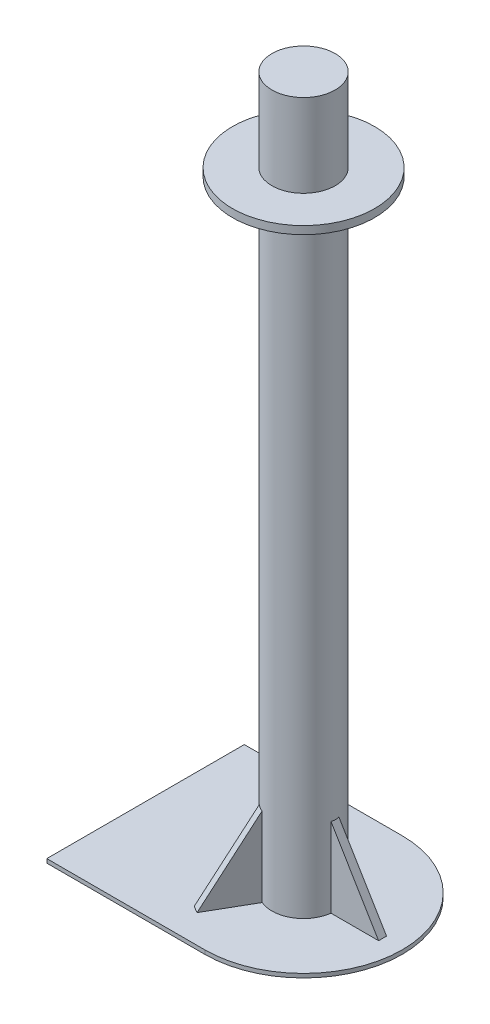
ISO-10303-21;
HEADER;
FILE_DESCRIPTION(('STEP AP214'),'2;1');
FILE_NAME('part.step','',(''),(''),'','','');
FILE_SCHEMA(('AUTOMOTIVE_DESIGN { 1 0 10303 214 1 1 1 1 }'));
ENDSEC;
DATA;
#1=APPLICATION_CONTEXT('core data for automotive mechanical design processes');
#2=APPLICATION_PROTOCOL_DEFINITION('international standard','automotive_design',2000,#1);
#3=PRODUCT_CONTEXT('',#1,'mechanical');
#4=PRODUCT('Part','Part','',(#3));
#5=PRODUCT_RELATED_PRODUCT_CATEGORY('part','',(#4));
#6=PRODUCT_DEFINITION_FORMATION('','',#4);
#7=PRODUCT_DEFINITION_CONTEXT('part definition',#1,'design');
#8=PRODUCT_DEFINITION('design','',#6,#7);
#9=PRODUCT_DEFINITION_SHAPE('','',#8);
#10=(LENGTH_UNIT() NAMED_UNIT(*) SI_UNIT(.MILLI.,.METRE.));
#11=(NAMED_UNIT(*) PLANE_ANGLE_UNIT() SI_UNIT($,.RADIAN.));
#12=(NAMED_UNIT(*) SI_UNIT($,.STERADIAN.) SOLID_ANGLE_UNIT());
#13=UNCERTAINTY_MEASURE_WITH_UNIT(LENGTH_MEASURE(1.E-05),#10,'distance_accuracy_value','');
#14=(GEOMETRIC_REPRESENTATION_CONTEXT(3) GLOBAL_UNCERTAINTY_ASSIGNED_CONTEXT((#13)) GLOBAL_UNIT_ASSIGNED_CONTEXT((#10,
#11,#12)) REPRESENTATION_CONTEXT('',''));
#15=CARTESIAN_POINT('',(0.,0.,0.));
#16=DIRECTION('',(0.,0.,1.));
#17=DIRECTION('',(1.,0.,0.));
#18=AXIS2_PLACEMENT_3D('',#15,#16,#17);
#19=CARTESIAN_POINT('',(-119.914163090129,5.,-125.));
#20=DIRECTION('',(0.,0.,1.));
#21=DIRECTION('',(1.,0.,0.));
#22=AXIS2_PLACEMENT_3D('',#19,#20,#21);
#23=PLANE('',#22);
#24=DIRECTION('',(-1.,0.,0.));
#25=VECTOR('',#24,1.);
#26=CARTESIAN_POINT('',(-119.914163090129,0.,-125.));
#27=LINE('',#26,#25);
#28=CARTESIAN_POINT('',(80.0858369098713,0.,-125.));
#29=VERTEX_POINT('',#28);
#30=CARTESIAN_POINT('',(-119.914163090129,0.,-125.));
#31=VERTEX_POINT('',#30);
#32=EDGE_CURVE('E189',#29,#31,#27,.T.);
#33=ORIENTED_EDGE('',*,*,#32,.T.);
#34=DIRECTION('',(0.,-1.,0.));
#35=VECTOR('',#34,1.);
#36=CARTESIAN_POINT('',(-119.914163090129,5.,-125.));
#37=LINE('',#36,#35);
#38=CARTESIAN_POINT('',(-119.914163090129,5.,-125.));
#39=VERTEX_POINT('',#38);
#40=EDGE_CURVE('E216',#39,#31,#37,.T.);
#41=ORIENTED_EDGE('',*,*,#40,.F.);
#42=DIRECTION('',(-1.,0.,0.));
#43=VECTOR('',#42,1.);
#44=CARTESIAN_POINT('',(-119.914163090129,5.,-125.));
#45=LINE('',#44,#43);
#46=CARTESIAN_POINT('',(80.0858369098713,5.,-125.));
#47=VERTEX_POINT('',#46);
#48=EDGE_CURVE('E190',#47,#39,#45,.T.);
#49=ORIENTED_EDGE('',*,*,#48,.F.);
#50=DIRECTION('',(0.,-1.,0.));
#51=VECTOR('',#50,1.);
#52=CARTESIAN_POINT('',(80.0858369098713,5.,-125.));
#53=LINE('',#52,#51);
#54=EDGE_CURVE('E200',#47,#29,#53,.T.);
#55=ORIENTED_EDGE('',*,*,#54,.T.);
#56=EDGE_LOOP('',(#33,#41,#49,#55));
#57=FACE_BOUND('',#56,.T.);
#58=ADVANCED_FACE('F36',(#57),#23,.F.);
#59=CARTESIAN_POINT('',(-119.914163090129,5.,125.));
#60=DIRECTION('',(1.,0.,0.));
#61=DIRECTION('',(0.,0.,-1.));
#62=AXIS2_PLACEMENT_3D('',#59,#60,#61);
#63=PLANE('',#62);
#64=DIRECTION('',(0.,0.,1.));
#65=VECTOR('',#64,1.);
#66=CARTESIAN_POINT('',(-119.914163090129,0.,125.));
#67=LINE('',#66,#65);
#68=CARTESIAN_POINT('',(-119.914163090129,0.,125.));
#69=VERTEX_POINT('',#68);
#70=EDGE_CURVE('E203',#31,#69,#67,.T.);
#71=ORIENTED_EDGE('',*,*,#70,.T.);
#72=DIRECTION('',(0.,-1.,0.));
#73=VECTOR('',#72,1.);
#74=CARTESIAN_POINT('',(-119.914163090129,5.,125.));
#75=LINE('',#74,#73);
#76=CARTESIAN_POINT('',(-119.914163090129,5.,125.));
#77=VERTEX_POINT('',#76);
#78=EDGE_CURVE('E213',#77,#69,#75,.T.);
#79=ORIENTED_EDGE('',*,*,#78,.F.);
#80=DIRECTION('',(0.,0.,1.));
#81=VECTOR('',#80,1.);
#82=CARTESIAN_POINT('',(-119.914163090129,5.,125.));
#83=LINE('',#82,#81);
#84=EDGE_CURVE('E193',#39,#77,#83,.T.);
#85=ORIENTED_EDGE('',*,*,#84,.F.);
#86=ORIENTED_EDGE('',*,*,#40,.T.);
#87=EDGE_LOOP('',(#71,#79,#85,#86));
#88=FACE_BOUND('',#87,.T.);
#89=ADVANCED_FACE('F268',(#88),#63,.F.);
#90=CARTESIAN_POINT('',(-119.914163090129,5.,125.));
#91=DIRECTION('',(0.,0.,-1.));
#92=DIRECTION('',(-1.,0.,0.));
#93=AXIS2_PLACEMENT_3D('',#90,#91,#92);
#94=PLANE('',#93);
#95=DIRECTION('',(1.,0.,0.));
#96=VECTOR('',#95,1.);
#97=CARTESIAN_POINT('',(-119.914163090129,0.,125.));
#98=LINE('',#97,#96);
#99=CARTESIAN_POINT('',(80.0858369098713,0.,125.));
#100=VERTEX_POINT('',#99);
#101=EDGE_CURVE('E205',#69,#100,#98,.T.);
#102=ORIENTED_EDGE('',*,*,#101,.T.);
#103=DIRECTION('',(0.,-1.,0.));
#104=VECTOR('',#103,1.);
#105=CARTESIAN_POINT('',(80.0858369098713,5.,125.));
#106=LINE('',#105,#104);
#107=CARTESIAN_POINT('',(80.0858369098713,5.,125.));
#108=VERTEX_POINT('',#107);
#109=EDGE_CURVE('E210',#108,#100,#106,.T.);
#110=ORIENTED_EDGE('',*,*,#109,.F.);
#111=DIRECTION('',(1.,0.,0.));
#112=VECTOR('',#111,1.);
#113=CARTESIAN_POINT('',(-119.914163090129,5.,125.));
#114=LINE('',#113,#112);
#115=EDGE_CURVE('E196',#77,#108,#114,.T.);
#116=ORIENTED_EDGE('',*,*,#115,.F.);
#117=ORIENTED_EDGE('',*,*,#78,.T.);
#118=EDGE_LOOP('',(#102,#110,#116,#117));
#119=FACE_BOUND('',#118,.T.);
#120=ADVANCED_FACE('F273',(#119),#94,.F.);
#121=CARTESIAN_POINT('',(80.0858369098713,5.,0.));
#122=DIRECTION('',(0.,-1.,0.));
#123=DIRECTION('',(0.,0.,-1.));
#124=AXIS2_PLACEMENT_3D('',#121,#122,#123);
#125=CYLINDRICAL_SURFACE('',#124,125.);
#126=CARTESIAN_POINT('',(80.0858369098713,0.,0.));
#127=DIRECTION('',(0.,1.,0.));
#128=DIRECTION('',(0.,0.,-1.));
#129=AXIS2_PLACEMENT_3D('',#126,#127,#128);
#130=CIRCLE('',#129,125.);
#131=EDGE_CURVE('E194',#100,#29,#130,.T.);
#132=ORIENTED_EDGE('',*,*,#131,.T.);
#133=ORIENTED_EDGE('',*,*,#54,.F.);
#134=CARTESIAN_POINT('',(80.0858369098713,5.,0.));
#135=DIRECTION('',(0.,1.,0.));
#136=DIRECTION('',(0.,0.,-1.));
#137=AXIS2_PLACEMENT_3D('',#134,#135,#136);
#138=CIRCLE('',#137,125.);
#139=EDGE_CURVE('E198',#108,#47,#138,.T.);
#140=ORIENTED_EDGE('',*,*,#139,.F.);
#141=ORIENTED_EDGE('',*,*,#109,.T.);
#142=EDGE_LOOP('',(#132,#133,#140,#141));
#143=FACE_BOUND('',#142,.T.);
#144=ADVANCED_FACE('F288',(#143),#125,.T.);
#145=CARTESIAN_POINT('',(80.0858369098713,5.,0.));
#146=DIRECTION('',(0.,-1.,0.));
#147=DIRECTION('',(0.,0.,-1.));
#148=AXIS2_PLACEMENT_3D('',#145,#146,#147);
#149=PLANE('',#148);
#150=DIRECTION('',(0.866025403784443,0.,0.499999999999992));
#151=VECTOR('',#150,1.);
#152=CARTESIAN_POINT('',(25.7557098909499,5.,84.1025403784443));
#153=LINE('',#152,#151);
#154=CARTESIAN_POINT('',(25.7557098909499,5.,84.1025403784443));
#155=VERTEX_POINT('',#154);
#156=CARTESIAN_POINT('',(34.4159639287943,5.,89.1025403784443));
#157=VERTEX_POINT('',#156);
#158=EDGE_CURVE('E50',#155,#157,#153,.T.);
#159=ORIENTED_EDGE('',*,*,#158,.F.);
#160=DIRECTION('',(0.499999999999992,0.,-0.866025403784443));
#161=VECTOR('',#160,1.);
#162=CARTESIAN_POINT('',(115.798628345884,4.99999999999998,-71.8563692472863));
#163=LINE('',#162,#161);
#164=CARTESIAN_POINT('',(55.912575057965,5.,31.869317712169));
#165=VERTEX_POINT('',#164);
#166=EDGE_CURVE('E142',#155,#165,#163,.T.);
#167=ORIENTED_EDGE('',*,*,#166,.T.);
#168=CARTESIAN_POINT('',(80.0858369098713,5.,0.));
#169=DIRECTION('',(0.,-1.,0.));
#170=DIRECTION('',(0.,0.,-1.));
#171=AXIS2_PLACEMENT_3D('',#168,#169,#170);
#172=CIRCLE('',#171,40.);
#173=CARTESIAN_POINT('',(55.9125750579645,5.,-31.8693177121687));
#174=VERTEX_POINT('',#173);
#175=EDGE_CURVE('E224',#174,#165,#172,.F.);
#176=ORIENTED_EDGE('',*,*,#175,.F.);
#177=DIRECTION('',(0.500000000000004,0.,0.866025403784436));
#178=VECTOR('',#177,1.);
#179=CARTESIAN_POINT('',(115.798628345885,4.99999999999998,71.8563692472858));
#180=LINE('',#179,#178);
#181=CARTESIAN_POINT('',(25.7557098909487,5.,-84.1025403784436));
#182=VERTEX_POINT('',#181);
#183=EDGE_CURVE('E150',#182,#174,#180,.T.);
#184=ORIENTED_EDGE('',*,*,#183,.F.);
#185=DIRECTION('',(-0.866025403784436,0.,0.500000000000004));
#186=VECTOR('',#185,1.);
#187=CARTESIAN_POINT('',(34.4159639287931,5.,-89.1025403784437));
#188=LINE('',#187,#186);
#189=CARTESIAN_POINT('',(34.4159639287931,5.,-89.1025403784437));
#190=VERTEX_POINT('',#189);
#191=EDGE_CURVE('E157',#190,#182,#188,.T.);
#192=ORIENTED_EDGE('',*,*,#191,.F.);
#193=DIRECTION('',(0.500000000000004,0.,0.866025403784436));
#194=VECTOR('',#193,1.);
#195=CARTESIAN_POINT('',(124.458882383729,4.99999999999998,66.8563692472858));
#196=LINE('',#195,#194);
#197=CARTESIAN_POINT('',(64.5728290958089,5.,-36.8693177121687));
#198=VERTEX_POINT('',#197);
#199=EDGE_CURVE('E151',#190,#198,#196,.T.);
#200=ORIENTED_EDGE('',*,*,#199,.T.);
#201=CARTESIAN_POINT('',(119.77210657584,5.,-5.));
#202=VERTEX_POINT('',#201);
#203=EDGE_CURVE('E220',#202,#198,#172,.F.);
#204=ORIENTED_EDGE('',*,*,#203,.F.);
#205=DIRECTION('',(-1.,0.,0.));
#206=VECTOR('',#205,1.);
#207=CARTESIAN_POINT('',(0.,4.99999999999998,-5.));
#208=LINE('',#207,#206);
#209=CARTESIAN_POINT('',(180.085836909871,5.,-5.));
#210=VERTEX_POINT('',#209);
#211=EDGE_CURVE('E164',#210,#202,#208,.T.);
#212=ORIENTED_EDGE('',*,*,#211,.F.);
#213=DIRECTION('',(0.,0.,-1.));
#214=VECTOR('',#213,1.);
#215=CARTESIAN_POINT('',(180.085836909871,5.,5.));
#216=LINE('',#215,#214);
#217=CARTESIAN_POINT('',(180.085836909871,5.,5.));
#218=VERTEX_POINT('',#217);
#219=EDGE_CURVE('E172',#218,#210,#216,.T.);
#220=ORIENTED_EDGE('',*,*,#219,.F.);
#221=DIRECTION('',(-1.,0.,0.));
#222=VECTOR('',#221,1.);
#223=CARTESIAN_POINT('',(0.,4.99999999999998,5.));
#224=LINE('',#223,#222);
#225=CARTESIAN_POINT('',(119.77210657584,5.,5.));
#226=VERTEX_POINT('',#225);
#227=EDGE_CURVE('E165',#218,#226,#224,.T.);
#228=ORIENTED_EDGE('',*,*,#227,.T.);
#229=CARTESIAN_POINT('',(64.5728290958094,5.,36.8693177121689));
#230=VERTEX_POINT('',#229);
#231=EDGE_CURVE('E219',#230,#226,#172,.F.);
#232=ORIENTED_EDGE('',*,*,#231,.F.);
#233=DIRECTION('',(0.499999999999992,0.,-0.866025403784443));
#234=VECTOR('',#233,1.);
#235=CARTESIAN_POINT('',(124.458882383729,4.99999999999998,-66.8563692472864));
#236=LINE('',#235,#234);
#237=EDGE_CURVE('E55',#157,#230,#236,.T.);
#238=ORIENTED_EDGE('',*,*,#237,.F.);
#239=EDGE_LOOP('',(#159,#167,#176,#184,#192,#200,#204,#212,#220,#228,#232,#238));
#240=FACE_BOUND('',#239,.T.);
#241=ORIENTED_EDGE('',*,*,#48,.T.);
#242=ORIENTED_EDGE('',*,*,#84,.T.);
#243=ORIENTED_EDGE('',*,*,#115,.T.);
#244=ORIENTED_EDGE('',*,*,#139,.T.);
#245=EDGE_LOOP('',(#241,#242,#243,#244));
#246=FACE_BOUND('',#245,.T.);
#247=ADVANCED_FACE('F251',(#240,#246),#149,.F.);
#248=CARTESIAN_POINT('',(80.0858369098713,0.,0.));
#249=DIRECTION('',(0.,-1.,0.));
#250=DIRECTION('',(0.,0.,-1.));
#251=AXIS2_PLACEMENT_3D('',#248,#249,#250);
#252=PLANE('',#251);
#253=ORIENTED_EDGE('',*,*,#32,.F.);
#254=ORIENTED_EDGE('',*,*,#131,.F.);
#255=ORIENTED_EDGE('',*,*,#101,.F.);
#256=ORIENTED_EDGE('',*,*,#70,.F.);
#257=EDGE_LOOP('',(#253,#254,#255,#256));
#258=FACE_BOUND('',#257,.T.);
#259=ADVANCED_FACE('F281',(#258),#252,.T.);
#260=CARTESIAN_POINT('',(80.0858369098713,905.,0.));
#261=DIRECTION('',(0.,-1.,0.));
#262=DIRECTION('',(0.,0.,-1.));
#263=AXIS2_PLACEMENT_3D('',#260,#261,#262);
#264=CYLINDRICAL_SURFACE('',#263,40.);
#265=CARTESIAN_POINT('',(80.0858369098713,790.,0.));
#266=DIRECTION('',(0.,-1.,0.));
#267=DIRECTION('',(0.,0.,-1.));
#268=AXIS2_PLACEMENT_3D('',#265,#266,#267);
#269=CIRCLE('',#268,40.);
#270=CARTESIAN_POINT('',(80.0858369098713,790.,-40.));
#271=VERTEX_POINT('',#270);
#272=EDGE_CURVE('E183',#271,#271,#269,.T.);
#273=ORIENTED_EDGE('',*,*,#272,.T.);
#274=EDGE_LOOP('',(#273));
#275=FACE_BOUND('',#274,.T.);
#276=ORIENTED_EDGE('',*,*,#175,.T.);
#277=DIRECTION('',(0.,-1.,0.));
#278=VECTOR('',#277,1.);
#279=CARTESIAN_POINT('',(55.912575057965,905.,31.869317712169));
#280=LINE('',#279,#278);
#281=CARTESIAN_POINT('',(55.912575057965,105.522883890052,31.869317712169));
#282=VERTEX_POINT('',#281);
#283=EDGE_CURVE('E11',#165,#282,#280,.F.);
#284=ORIENTED_EDGE('',*,*,#283,.T.);
#285=CARTESIAN_POINT('',(80.0858369098713,171.666666666667,0.));
#286=DIRECTION('',(-0.428746462856265,0.514495755427526,0.74261065723251));
#287=DIRECTION('',(-0.257247877713759,-0.857492925712544,0.445566394339506));
#288=AXIS2_PLACEMENT_3D('',#285,#286,#287);
#289=ELLIPSE('',#288,77.746025264604,40.);
#290=CARTESIAN_POINT('',(64.5728290958094,105.522883890052,36.8693177121689));
#291=VERTEX_POINT('',#290);
#292=EDGE_CURVE('E43',#282,#291,#289,.T.);
#293=ORIENTED_EDGE('',*,*,#292,.T.);
#294=DIRECTION('',(0.,-1.,0.));
#295=VECTOR('',#294,1.);
#296=CARTESIAN_POINT('',(64.5728290958094,905.,36.8693177121689));
#297=LINE('',#296,#295);
#298=EDGE_CURVE('E131',#230,#291,#297,.F.);
#299=ORIENTED_EDGE('',*,*,#298,.F.);
#300=ORIENTED_EDGE('',*,*,#231,.T.);
#301=DIRECTION('',(0.,-1.,0.));
#302=VECTOR('',#301,1.);
#303=CARTESIAN_POINT('',(119.77210657584,905.,5.));
#304=LINE('',#303,#302);
#305=CARTESIAN_POINT('',(119.77210657584,105.522883890052,5.));
#306=VERTEX_POINT('',#305);
#307=EDGE_CURVE('E234',#226,#306,#304,.F.);
#308=ORIENTED_EDGE('',*,*,#307,.T.);
#309=CARTESIAN_POINT('',(80.0858369098713,171.666666666667,0.));
#310=DIRECTION('',(0.857492925712544,0.514495755427526,0.));
#311=DIRECTION('',(0.514495755427526,-0.857492925712544,0.));
#312=AXIS2_PLACEMENT_3D('',#309,#310,#311);
#313=ELLIPSE('',#312,77.746025264604,40.);
#314=CARTESIAN_POINT('',(119.77210657584,105.522883890052,-5.));
#315=VERTEX_POINT('',#314);
#316=EDGE_CURVE('E232',#306,#315,#313,.T.);
#317=ORIENTED_EDGE('',*,*,#316,.T.);
#318=DIRECTION('',(0.,-1.,0.));
#319=VECTOR('',#318,1.);
#320=CARTESIAN_POINT('',(119.77210657584,905.,-5.));
#321=LINE('',#320,#319);
#322=EDGE_CURVE('E229',#202,#315,#321,.F.);
#323=ORIENTED_EDGE('',*,*,#322,.F.);
#324=ORIENTED_EDGE('',*,*,#203,.T.);
#325=DIRECTION('',(0.,-1.,0.));
#326=VECTOR('',#325,1.);
#327=CARTESIAN_POINT('',(64.5728290958089,905.,-36.8693177121687));
#328=LINE('',#327,#326);
#329=CARTESIAN_POINT('',(64.5728290958089,105.522883890052,-36.8693177121687));
#330=VERTEX_POINT('',#329);
#331=EDGE_CURVE('E139',#198,#330,#328,.F.);
#332=ORIENTED_EDGE('',*,*,#331,.T.);
#333=CARTESIAN_POINT('',(80.0858369098713,171.666666666667,0.));
#334=DIRECTION('',(-0.428746462856276,0.514495755427527,-0.742610657232504));
#335=DIRECTION('',(-0.257247877713765,-0.857492925712544,-0.445566394339502));
#336=AXIS2_PLACEMENT_3D('',#333,#334,#335);
#337=ELLIPSE('',#336,77.746025264604,40.);
#338=CARTESIAN_POINT('',(55.9125750579645,105.522883890052,-31.8693177121687));
#339=VERTEX_POINT('',#338);
#340=EDGE_CURVE('E239',#330,#339,#337,.T.);
#341=ORIENTED_EDGE('',*,*,#340,.T.);
#342=DIRECTION('',(0.,-1.,0.));
#343=VECTOR('',#342,1.);
#344=CARTESIAN_POINT('',(55.9125750579645,905.,-31.8693177121687));
#345=LINE('',#344,#343);
#346=EDGE_CURVE('E236',#174,#339,#345,.F.);
#347=ORIENTED_EDGE('',*,*,#346,.F.);
#348=EDGE_LOOP('',(#276,#284,#293,#299,#300,#308,#317,#323,#324,#332,#341,#347));
#349=FACE_BOUND('',#348,.T.);
#350=ADVANCED_FACE('F130',(#275,#349),#264,.T.);
#351=CARTESIAN_POINT('',(80.0858369098713,800.,0.));
#352=DIRECTION('',(0.,-1.,0.));
#353=DIRECTION('',(0.,0.,-1.));
#354=AXIS2_PLACEMENT_3D('',#351,#352,#353);
#355=CYLINDRICAL_SURFACE('',#354,90.);
#356=CARTESIAN_POINT('',(80.0858369098713,800.,0.));
#357=DIRECTION('',(0.,-1.,0.));
#358=DIRECTION('',(0.,0.,-1.));
#359=AXIS2_PLACEMENT_3D('',#356,#357,#358);
#360=CIRCLE('',#359,90.);
#361=CARTESIAN_POINT('',(80.0858369098713,800.,-90.));
#362=VERTEX_POINT('',#361);
#363=EDGE_CURVE('E180',#362,#362,#360,.T.);
#364=ORIENTED_EDGE('',*,*,#363,.T.);
#365=EDGE_LOOP('',(#364));
#366=FACE_BOUND('',#365,.T.);
#367=CARTESIAN_POINT('',(80.0858369098713,790.,0.));
#368=DIRECTION('',(0.,-1.,0.));
#369=DIRECTION('',(0.,0.,-1.));
#370=AXIS2_PLACEMENT_3D('',#367,#368,#369);
#371=CIRCLE('',#370,90.);
#372=CARTESIAN_POINT('',(80.0858369098713,790.,-90.));
#373=VERTEX_POINT('',#372);
#374=EDGE_CURVE('E179',#373,#373,#371,.T.);
#375=ORIENTED_EDGE('',*,*,#374,.F.);
#376=EDGE_LOOP('',(#375));
#377=FACE_BOUND('',#376,.T.);
#378=ADVANCED_FACE('F303',(#366,#377),#355,.T.);
#379=CARTESIAN_POINT('',(80.0858369098713,800.,0.));
#380=DIRECTION('',(0.,-1.,0.));
#381=DIRECTION('',(0.,0.,-1.));
#382=AXIS2_PLACEMENT_3D('',#379,#380,#381);
#383=PLANE('',#382);
#384=CARTESIAN_POINT('',(80.0858369098713,800.,0.));
#385=DIRECTION('',(0.,-1.,0.));
#386=DIRECTION('',(0.,0.,-1.));
#387=AXIS2_PLACEMENT_3D('',#384,#385,#386);
#388=CIRCLE('',#387,40.);
#389=CARTESIAN_POINT('',(80.0858369098713,800.,-40.));
#390=VERTEX_POINT('',#389);
#391=EDGE_CURVE('E223',#390,#390,#388,.T.);
#392=ORIENTED_EDGE('',*,*,#391,.T.);
#393=EDGE_LOOP('',(#392));
#394=FACE_BOUND('',#393,.T.);
#395=ORIENTED_EDGE('',*,*,#363,.F.);
#396=EDGE_LOOP('',(#395));
#397=FACE_BOUND('',#396,.T.);
#398=ADVANCED_FACE('F313',(#394,#397),#383,.F.);
#399=CARTESIAN_POINT('',(80.0858369098713,790.,0.));
#400=DIRECTION('',(0.,-1.,0.));
#401=DIRECTION('',(0.,0.,-1.));
#402=AXIS2_PLACEMENT_3D('',#399,#400,#401);
#403=PLANE('',#402);
#404=ORIENTED_EDGE('',*,*,#272,.F.);
#405=EDGE_LOOP('',(#404));
#406=FACE_BOUND('',#405,.T.);
#407=ORIENTED_EDGE('',*,*,#374,.T.);
#408=EDGE_LOOP('',(#407));
#409=FACE_BOUND('',#408,.T.);
#410=ADVANCED_FACE('F309',(#406,#409),#403,.T.);
#411=CARTESIAN_POINT('',(80.0858369098713,905.,0.));
#412=DIRECTION('',(0.,1.,0.));
#413=DIRECTION('',(0.,0.,1.));
#414=AXIS2_PLACEMENT_3D('',#411,#412,#413);
#415=PLANE('',#414);
#416=CARTESIAN_POINT('',(80.0858369098713,905.,0.));
#417=DIRECTION('',(0.,1.,0.));
#418=DIRECTION('',(0.,0.,1.));
#419=AXIS2_PLACEMENT_3D('',#416,#417,#418);
#420=CIRCLE('',#419,40.);
#421=CARTESIAN_POINT('',(80.0858369098713,905.,40.));
#422=VERTEX_POINT('',#421);
#423=EDGE_CURVE('E186',#422,#422,#420,.T.);
#424=ORIENTED_EDGE('',*,*,#423,.T.);
#425=EDGE_LOOP('',(#424));
#426=FACE_BOUND('',#425,.T.);
#427=ADVANCED_FACE('F306',(#426),#415,.T.);
#428=ORIENTED_EDGE('',*,*,#423,.F.);
#429=EDGE_LOOP('',(#428));
#430=FACE_BOUND('',#429,.T.);
#431=ORIENTED_EDGE('',*,*,#391,.F.);
#432=EDGE_LOOP('',(#431));
#433=FACE_BOUND('',#432,.T.);
#434=ADVANCED_FACE('F305',(#430,#433),#264,.T.);
#435=CARTESIAN_POINT('',(0.,0.,5.));
#436=DIRECTION('',(0.,0.,1.));
#437=DIRECTION('',(1.,0.,0.));
#438=AXIS2_PLACEMENT_3D('',#435,#436,#437);
#439=PLANE('',#438);
#440=ORIENTED_EDGE('',*,*,#307,.F.);
#441=ORIENTED_EDGE('',*,*,#227,.F.);
#442=DIRECTION('',(0.514495755427526,-0.857492925712544,0.));
#443=VECTOR('',#442,1.);
#444=CARTESIAN_POINT('',(134.621938904317,80.7731633425903,5.));
#445=LINE('',#444,#443);
#446=EDGE_CURVE('E168',#306,#218,#445,.T.);
#447=ORIENTED_EDGE('',*,*,#446,.F.);
#448=EDGE_LOOP('',(#440,#441,#447));
#449=FACE_BOUND('',#448,.T.);
#450=ADVANCED_FACE('F328',(#449),#439,.T.);
#451=CARTESIAN_POINT('',(0.,0.,-5.));
#452=DIRECTION('',(0.,0.,1.));
#453=DIRECTION('',(1.,0.,0.));
#454=AXIS2_PLACEMENT_3D('',#451,#452,#453);
#455=PLANE('',#454);
#456=ORIENTED_EDGE('',*,*,#211,.T.);
#457=ORIENTED_EDGE('',*,*,#322,.T.);
#458=DIRECTION('',(0.514495755427526,-0.857492925712544,0.));
#459=VECTOR('',#458,1.);
#460=CARTESIAN_POINT('',(134.621938904317,80.7731633425903,-5.));
#461=LINE('',#460,#459);
#462=EDGE_CURVE('E169',#315,#210,#461,.T.);
#463=ORIENTED_EDGE('',*,*,#462,.T.);
#464=EDGE_LOOP('',(#456,#457,#463));
#465=FACE_BOUND('',#464,.T.);
#466=ADVANCED_FACE('F324',(#465),#455,.F.);
#467=CARTESIAN_POINT('',(134.621938904317,80.7731633425903,5.));
#468=DIRECTION('',(0.857492925712544,0.514495755427526,0.));
#469=DIRECTION('',(-0.514495755427526,0.857492925712544,0.));
#470=AXIS2_PLACEMENT_3D('',#467,#468,#469);
#471=PLANE('',#470);
#472=ORIENTED_EDGE('',*,*,#316,.F.);
#473=ORIENTED_EDGE('',*,*,#446,.T.);
#474=ORIENTED_EDGE('',*,*,#219,.T.);
#475=ORIENTED_EDGE('',*,*,#462,.F.);
#476=EDGE_LOOP('',(#472,#473,#474,#475));
#477=FACE_BOUND('',#476,.T.);
#478=ADVANCED_FACE('F321',(#477),#471,.T.);
#479=CARTESIAN_POINT('',(124.458882383729,0.,66.8563692472858));
#480=DIRECTION('',(0.866025403784436,0.,-0.500000000000004));
#481=DIRECTION('',(-0.500000000000004,0.,-0.866025403784436));
#482=AXIS2_PLACEMENT_3D('',#479,#480,#481);
#483=PLANE('',#482);
#484=ORIENTED_EDGE('',*,*,#331,.F.);
#485=ORIENTED_EDGE('',*,*,#199,.F.);
#486=DIRECTION('',(-0.257247877713765,-0.857492925712544,-0.445566394339502));
#487=VECTOR('',#486,1.);
#488=CARTESIAN_POINT('',(57.1479129315703,80.7731633425903,-49.7296497505692));
#489=LINE('',#488,#487);
#490=EDGE_CURVE('E153',#330,#190,#489,.T.);
#491=ORIENTED_EDGE('',*,*,#490,.F.);
#492=EDGE_LOOP('',(#484,#485,#491));
#493=FACE_BOUND('',#492,.T.);
#494=ADVANCED_FACE('F250',(#493),#483,.T.);
#495=CARTESIAN_POINT('',(115.798628345885,0.,71.8563692472858));
#496=DIRECTION('',(0.866025403784436,0.,-0.500000000000004));
#497=DIRECTION('',(-0.500000000000004,0.,-0.866025403784436));
#498=AXIS2_PLACEMENT_3D('',#495,#496,#497);
#499=PLANE('',#498);
#500=ORIENTED_EDGE('',*,*,#183,.T.);
#501=ORIENTED_EDGE('',*,*,#346,.T.);
#502=DIRECTION('',(-0.257247877713765,-0.857492925712544,-0.445566394339502));
#503=VECTOR('',#502,1.);
#504=CARTESIAN_POINT('',(48.487658893726,80.7731633425903,-44.7296497505691));
#505=LINE('',#504,#503);
#506=EDGE_CURVE('E154',#339,#182,#505,.T.);
#507=ORIENTED_EDGE('',*,*,#506,.T.);
#508=EDGE_LOOP('',(#500,#501,#507));
#509=FACE_BOUND('',#508,.T.);
#510=ADVANCED_FACE('F255',(#509),#499,.F.);
#511=CARTESIAN_POINT('',(57.1479129315703,80.7731633425903,-49.7296497505692));
#512=DIRECTION('',(-0.428746462856276,0.514495755427527,-0.742610657232504));
#513=DIRECTION('',(0.,0.821994936526786,0.5694947974515));
#514=AXIS2_PLACEMENT_3D('',#511,#512,#513);
#515=PLANE('',#514);
#516=ORIENTED_EDGE('',*,*,#340,.F.);
#517=ORIENTED_EDGE('',*,*,#490,.T.);
#518=ORIENTED_EDGE('',*,*,#191,.T.);
#519=ORIENTED_EDGE('',*,*,#506,.F.);
#520=EDGE_LOOP('',(#516,#517,#518,#519));
#521=FACE_BOUND('',#520,.T.);
#522=ADVANCED_FACE('F249',(#521),#515,.T.);
#523=CARTESIAN_POINT('',(115.798628345884,0.,-71.8563692472863));
#524=DIRECTION('',(-0.866025403784443,0.,-0.499999999999992));
#525=DIRECTION('',(-0.499999999999992,0.,0.866025403784443));
#526=AXIS2_PLACEMENT_3D('',#523,#524,#525);
#527=PLANE('',#526);
#528=ORIENTED_EDGE('',*,*,#283,.F.);
#529=ORIENTED_EDGE('',*,*,#166,.F.);
#530=DIRECTION('',(-0.257247877713759,-0.857492925712544,0.445566394339506));
#531=VECTOR('',#530,1.);
#532=CARTESIAN_POINT('',(48.4876588937266,80.7731633425903,44.7296497505696));
#533=LINE('',#532,#531);
#534=EDGE_CURVE('E144',#282,#155,#533,.T.);
#535=ORIENTED_EDGE('',*,*,#534,.F.);
#536=EDGE_LOOP('',(#528,#529,#535));
#537=FACE_BOUND('',#536,.T.);
#538=ADVANCED_FACE('F258',(#537),#527,.T.);
#539=CARTESIAN_POINT('',(124.458882383729,0.,-66.8563692472864));
#540=DIRECTION('',(-0.866025403784443,0.,-0.499999999999992));
#541=DIRECTION('',(-0.499999999999992,0.,0.866025403784443));
#542=AXIS2_PLACEMENT_3D('',#539,#540,#541);
#543=PLANE('',#542);
#544=ORIENTED_EDGE('',*,*,#237,.T.);
#545=ORIENTED_EDGE('',*,*,#298,.T.);
#546=DIRECTION('',(-0.257247877713759,-0.857492925712544,0.445566394339506));
#547=VECTOR('',#546,1.);
#548=CARTESIAN_POINT('',(57.147912931571,80.7731633425903,49.7296497505695));
#549=LINE('',#548,#547);
#550=EDGE_CURVE('E138',#291,#157,#549,.T.);
#551=ORIENTED_EDGE('',*,*,#550,.T.);
#552=EDGE_LOOP('',(#544,#545,#551));
#553=FACE_BOUND('',#552,.T.);
#554=ADVANCED_FACE('F137',(#553),#543,.F.);
#555=CARTESIAN_POINT('',(48.4876588937266,80.7731633425903,44.7296497505696));
#556=DIRECTION('',(-0.428746462856265,0.514495755427526,0.74261065723251));
#557=DIRECTION('',(0.,-0.821994936526788,0.569494797451497));
#558=AXIS2_PLACEMENT_3D('',#555,#556,#557);
#559=PLANE('',#558);
#560=ORIENTED_EDGE('',*,*,#292,.F.);
#561=ORIENTED_EDGE('',*,*,#534,.T.);
#562=ORIENTED_EDGE('',*,*,#158,.T.);
#563=ORIENTED_EDGE('',*,*,#550,.F.);
#564=EDGE_LOOP('',(#560,#561,#562,#563));
#565=FACE_BOUND('',#564,.T.);
#566=ADVANCED_FACE('F141',(#565),#559,.T.);
#567=CLOSED_SHELL('',(#58,#89,#120,#144,#247,#259,#350,#378,#398,#410,#427,#434,#450,#466,#478,
#494,#510,#522,#538,#554,#566));
#568=MANIFOLD_SOLID_BREP('B2',#567);
#569=ADVANCED_BREP_SHAPE_REPRESENTATION('',(#18,#568),#14);
#570=SHAPE_DEFINITION_REPRESENTATION(#9,#569);
ENDSEC;
END-ISO-10303-21;
